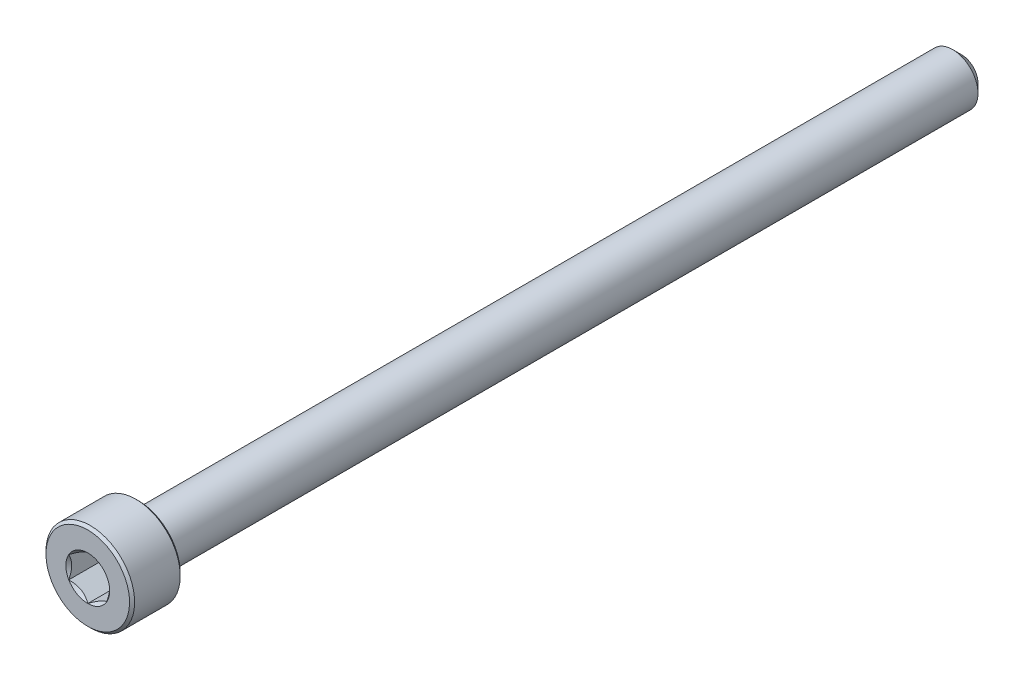
ISO-10303-21;
HEADER;
FILE_DESCRIPTION(('STEP AP214'),'2;1');
FILE_NAME('part.step','',(''),(''),'','','');
FILE_SCHEMA(('AUTOMOTIVE_DESIGN { 1 0 10303 214 1 1 1 1 }'));
ENDSEC;
DATA;
#1=APPLICATION_CONTEXT('core data for automotive mechanical design processes');
#2=APPLICATION_PROTOCOL_DEFINITION('international standard','automotive_design',2000,#1);
#3=PRODUCT_CONTEXT('',#1,'mechanical');
#4=PRODUCT('Part','Part','',(#3));
#5=PRODUCT_RELATED_PRODUCT_CATEGORY('part','',(#4));
#6=PRODUCT_DEFINITION_FORMATION('','',#4);
#7=PRODUCT_DEFINITION_CONTEXT('part definition',#1,'design');
#8=PRODUCT_DEFINITION('design','',#6,#7);
#9=PRODUCT_DEFINITION_SHAPE('','',#8);
#10=(LENGTH_UNIT() NAMED_UNIT(*) SI_UNIT(.MILLI.,.METRE.));
#11=(NAMED_UNIT(*) PLANE_ANGLE_UNIT() SI_UNIT($,.RADIAN.));
#12=(NAMED_UNIT(*) SI_UNIT($,.STERADIAN.) SOLID_ANGLE_UNIT());
#13=UNCERTAINTY_MEASURE_WITH_UNIT(LENGTH_MEASURE(1.E-05),#10,'distance_accuracy_value','');
#14=(GEOMETRIC_REPRESENTATION_CONTEXT(3) GLOBAL_UNCERTAINTY_ASSIGNED_CONTEXT((#13)) GLOBAL_UNIT_ASSIGNED_CONTEXT((#10,
#11,#12)) REPRESENTATION_CONTEXT('',''));
#15=CARTESIAN_POINT('',(0.,0.,0.));
#16=DIRECTION('',(0.,0.,1.));
#17=DIRECTION('',(1.,0.,0.));
#18=AXIS2_PLACEMENT_3D('',#15,#16,#17);
#19=CARTESIAN_POINT('',(0.,0.,34.5));
#20=DIRECTION('',(0.,0.,1.));
#21=DIRECTION('',(0.,-1.,0.));
#22=AXIS2_PLACEMENT_3D('',#19,#20,#21);
#23=PLANE('',#22);
#24=CARTESIAN_POINT('',(0.,0.,34.5));
#25=DIRECTION('',(0.,0.,1.));
#26=DIRECTION('',(1.,0.,0.));
#27=AXIS2_PLACEMENT_3D('',#24,#25,#26);
#28=CIRCLE('',#27,1.73205080756888);
#29=CARTESIAN_POINT('',(0.,-1.73205080756888,34.5));
#30=VERTEX_POINT('',#29);
#31=CARTESIAN_POINT('',(1.5,-0.866025403784438,34.5));
#32=VERTEX_POINT('',#31);
#33=EDGE_CURVE('E99',#30,#32,#28,.T.);
#34=ORIENTED_EDGE('',*,*,#33,.F.);
#35=CARTESIAN_POINT('',(-1.5,-0.866025403784438,34.5));
#36=VERTEX_POINT('',#35);
#37=EDGE_CURVE('E269',#36,#30,#28,.T.);
#38=ORIENTED_EDGE('',*,*,#37,.F.);
#39=CARTESIAN_POINT('',(-1.5,0.866025403784439,34.5));
#40=VERTEX_POINT('',#39);
#41=EDGE_CURVE('E134',#40,#36,#28,.T.);
#42=ORIENTED_EDGE('',*,*,#41,.F.);
#43=CARTESIAN_POINT('',(0.,1.73205080756888,34.5));
#44=VERTEX_POINT('',#43);
#45=EDGE_CURVE('E130',#44,#40,#28,.T.);
#46=ORIENTED_EDGE('',*,*,#45,.F.);
#47=CARTESIAN_POINT('',(1.5,0.866025403784439,34.5));
#48=VERTEX_POINT('',#47);
#49=EDGE_CURVE('E101',#48,#44,#28,.T.);
#50=ORIENTED_EDGE('',*,*,#49,.F.);
#51=EDGE_CURVE('E93',#32,#48,#28,.T.);
#52=ORIENTED_EDGE('',*,*,#51,.F.);
#53=EDGE_LOOP('',(#34,#38,#42,#46,#50,#52));
#54=FACE_BOUND('',#53,.T.);
#55=CARTESIAN_POINT('',(0.,0.,34.5));
#56=DIRECTION('',(0.,0.,-1.));
#57=DIRECTION('',(0.,1.,0.));
#58=AXIS2_PLACEMENT_3D('',#55,#56,#57);
#59=CIRCLE('',#58,3.3);
#60=CARTESIAN_POINT('',(0.,3.3,34.5));
#61=VERTEX_POINT('',#60);
#62=EDGE_CURVE('E49',#61,#61,#59,.T.);
#63=ORIENTED_EDGE('',*,*,#62,.F.);
#64=EDGE_LOOP('',(#63));
#65=FACE_BOUND('',#64,.T.);
#66=ADVANCED_FACE('F36',(#54,#65),#23,.T.);
#67=CARTESIAN_POINT('',(0.,0.,34.3));
#68=DIRECTION('',(0.,0.,-1.));
#69=DIRECTION('',(0.,1.,0.));
#70=AXIS2_PLACEMENT_3D('',#67,#68,#69);
#71=CONICAL_SURFACE('',#70,3.5,0.785398163397435);
#72=ORIENTED_EDGE('',*,*,#62,.T.);
#73=EDGE_LOOP('',(#72));
#74=FACE_BOUND('',#73,.T.);
#75=CARTESIAN_POINT('',(0.,0.,34.3));
#76=DIRECTION('',(0.,0.,-1.));
#77=DIRECTION('',(0.,1.,0.));
#78=AXIS2_PLACEMENT_3D('',#75,#76,#77);
#79=CIRCLE('',#78,3.5);
#80=CARTESIAN_POINT('',(0.,3.5,34.3));
#81=VERTEX_POINT('',#80);
#82=EDGE_CURVE('E220',#81,#81,#79,.T.);
#83=ORIENTED_EDGE('',*,*,#82,.F.);
#84=EDGE_LOOP('',(#83));
#85=FACE_BOUND('',#84,.T.);
#86=ADVANCED_FACE('F208',(#74,#85),#71,.T.);
#87=CARTESIAN_POINT('',(0.,0.,-34.5));
#88=DIRECTION('',(0.,0.,-1.));
#89=DIRECTION('',(0.,1.,0.));
#90=AXIS2_PLACEMENT_3D('',#87,#88,#89);
#91=CYLINDRICAL_SURFACE('',#90,3.5);
#92=ORIENTED_EDGE('',*,*,#82,.T.);
#93=EDGE_LOOP('',(#92));
#94=FACE_BOUND('',#93,.T.);
#95=CARTESIAN_POINT('',(0.,0.,30.7));
#96=DIRECTION('',(0.,0.,-1.));
#97=DIRECTION('',(0.,1.,0.));
#98=AXIS2_PLACEMENT_3D('',#95,#96,#97);
#99=CIRCLE('',#98,3.5);
#100=CARTESIAN_POINT('',(0.,3.5,30.7));
#101=VERTEX_POINT('',#100);
#102=EDGE_CURVE('E221',#101,#101,#99,.T.);
#103=ORIENTED_EDGE('',*,*,#102,.F.);
#104=EDGE_LOOP('',(#103));
#105=FACE_BOUND('',#104,.T.);
#106=ADVANCED_FACE('F205',(#94,#105),#91,.T.);
#107=CARTESIAN_POINT('',(0.,0.,30.5));
#108=DIRECTION('',(0.,0.,1.));
#109=DIRECTION('',(0.,-1.,0.));
#110=AXIS2_PLACEMENT_3D('',#107,#108,#109);
#111=CONICAL_SURFACE('',#110,3.3,0.785398163397434);
#112=ORIENTED_EDGE('',*,*,#102,.T.);
#113=EDGE_LOOP('',(#112));
#114=FACE_BOUND('',#113,.T.);
#115=CARTESIAN_POINT('',(0.,0.,30.5));
#116=DIRECTION('',(0.,0.,-1.));
#117=DIRECTION('',(0.,1.,0.));
#118=AXIS2_PLACEMENT_3D('',#115,#116,#117);
#119=CIRCLE('',#118,3.3);
#120=CARTESIAN_POINT('',(0.,3.3,30.5));
#121=VERTEX_POINT('',#120);
#122=EDGE_CURVE('E224',#121,#121,#119,.T.);
#123=ORIENTED_EDGE('',*,*,#122,.F.);
#124=EDGE_LOOP('',(#123));
#125=FACE_BOUND('',#124,.T.);
#126=ADVANCED_FACE('F201',(#114,#125),#111,.T.);
#127=CARTESIAN_POINT('',(0.,3.3,30.5));
#128=DIRECTION('',(0.,0.,-1.));
#129=DIRECTION('',(0.,1.,0.));
#130=AXIS2_PLACEMENT_3D('',#127,#128,#129);
#131=PLANE('',#130);
#132=ORIENTED_EDGE('',*,*,#122,.T.);
#133=EDGE_LOOP('',(#132));
#134=FACE_BOUND('',#133,.T.);
#135=CARTESIAN_POINT('',(0.,0.,30.5));
#136=DIRECTION('',(0.,0.,-1.));
#137=DIRECTION('',(0.,1.,0.));
#138=AXIS2_PLACEMENT_3D('',#135,#136,#137);
#139=CIRCLE('',#138,1.99999999999999);
#140=CARTESIAN_POINT('',(0.,1.99999999999999,30.5));
#141=VERTEX_POINT('',#140);
#142=EDGE_CURVE('E229',#141,#141,#139,.T.);
#143=ORIENTED_EDGE('',*,*,#142,.F.);
#144=EDGE_LOOP('',(#143));
#145=FACE_BOUND('',#144,.T.);
#146=ADVANCED_FACE('F197',(#134,#145),#131,.T.);
#147=CARTESIAN_POINT('',(0.,0.,-34.5));
#148=DIRECTION('',(0.,0.,-1.));
#149=DIRECTION('',(0.,1.,0.));
#150=AXIS2_PLACEMENT_3D('',#147,#148,#149);
#151=CYLINDRICAL_SURFACE('',#150,1.99999999999999);
#152=ORIENTED_EDGE('',*,*,#142,.T.);
#153=EDGE_LOOP('',(#152));
#154=FACE_BOUND('',#153,.T.);
#155=CARTESIAN_POINT('',(0.,0.,-33.8));
#156=DIRECTION('',(0.,0.,-1.));
#157=DIRECTION('',(0.,1.,0.));
#158=AXIS2_PLACEMENT_3D('',#155,#156,#157);
#159=CIRCLE('',#158,2.);
#160=CARTESIAN_POINT('',(0.,2.,-33.8));
#161=VERTEX_POINT('',#160);
#162=EDGE_CURVE('E232',#161,#161,#159,.T.);
#163=ORIENTED_EDGE('',*,*,#162,.F.);
#164=EDGE_LOOP('',(#163));
#165=FACE_BOUND('',#164,.T.);
#166=ADVANCED_FACE('F193',(#154,#165),#151,.T.);
#167=CARTESIAN_POINT('',(0.,0.,-34.5));
#168=DIRECTION('',(0.,0.,1.));
#169=DIRECTION('',(0.,-1.,0.));
#170=AXIS2_PLACEMENT_3D('',#167,#168,#169);
#171=CONICAL_SURFACE('',#170,1.3,0.785398163397449);
#172=ORIENTED_EDGE('',*,*,#162,.T.);
#173=EDGE_LOOP('',(#172));
#174=FACE_BOUND('',#173,.T.);
#175=CARTESIAN_POINT('',(0.,0.,-34.5));
#176=DIRECTION('',(0.,0.,-1.));
#177=DIRECTION('',(0.,1.,0.));
#178=AXIS2_PLACEMENT_3D('',#175,#176,#177);
#179=CIRCLE('',#178,1.3);
#180=CARTESIAN_POINT('',(0.,1.3,-34.5));
#181=VERTEX_POINT('',#180);
#182=EDGE_CURVE('E235',#181,#181,#179,.T.);
#183=ORIENTED_EDGE('',*,*,#182,.F.);
#184=EDGE_LOOP('',(#183));
#185=FACE_BOUND('',#184,.T.);
#186=ADVANCED_FACE('F189',(#174,#185),#171,.T.);
#187=CARTESIAN_POINT('',(0.,1.3,-34.5));
#188=DIRECTION('',(0.,0.,-1.));
#189=DIRECTION('',(0.,1.,0.));
#190=AXIS2_PLACEMENT_3D('',#187,#188,#189);
#191=PLANE('',#190);
#192=ORIENTED_EDGE('',*,*,#182,.T.);
#193=EDGE_LOOP('',(#192));
#194=FACE_BOUND('',#193,.T.);
#195=ADVANCED_FACE('F186',(#194),#191,.T.);
#196=CARTESIAN_POINT('',(0.,0.,34.5));
#197=DIRECTION('',(0.,0.,1.));
#198=DIRECTION('',(1.,0.,0.));
#199=AXIS2_PLACEMENT_3D('',#196,#197,#198);
#200=CONICAL_SURFACE('',#199,1.73205080756888,0.78539816339745);
#201=ORIENTED_EDGE('',*,*,#33,.T.);
#202=CARTESIAN_POINT('',(-0.000199999999999772,-1.73216627762271,34.5001154816001));
#203=CARTESIAN_POINT('',(0.0513677907370751,-1.70239359975915,34.4703654760673));
#204=CARTESIAN_POINT('',(0.103797917665199,-1.67212305186355,34.4423624839103));
#205=CARTESIAN_POINT('',(0.210709034055595,-1.61039789003619,34.3910892304401));
#206=CARTESIAN_POINT('',(0.26520019581466,-1.57893740312614,34.3678475050444));
#207=CARTESIAN_POINT('',(0.375079081357247,-1.51549879897987,34.3280337289922));
#208=CARTESIAN_POINT('',(0.430438809095198,-1.4835368452681,34.3113615856709));
#209=CARTESIAN_POINT('',(0.542377257477148,-1.41890915196211,34.2856744568181));
#210=CARTESIAN_POINT('',(0.598952556553006,-1.38624538781118,34.2766402904789));
#211=CARTESIAN_POINT('',(0.696455389516438,-1.329952100953,34.2684890812269));
#212=CARTESIAN_POINT('',(0.737256908280463,-1.30639533311124,34.2672822529892));
#213=CARTESIAN_POINT('',(0.818787969615855,-1.25932335290193,34.2693140571623));
#214=CARTESIAN_POINT('',(0.859517494314627,-1.23580815085313,34.2725536707483));
#215=CARTESIAN_POINT('',(0.940584402163413,-1.18900414978427,34.283291985982));
#216=CARTESIAN_POINT('',(0.980921384598285,-1.1657155821172,34.2907946530187));
#217=CARTESIAN_POINT('',(1.06091833691403,-1.11952932016335,34.3096516119283));
#218=CARTESIAN_POINT('',(1.1005780085162,-1.09663179808786,34.3210075570186));
#219=CARTESIAN_POINT('',(1.20216313477448,-1.03798159809699,34.3547216475927));
#220=CARTESIAN_POINT('',(1.26345855370968,-1.00259267147465,34.3796218490934));
#221=CARTESIAN_POINT('',(1.35358562846331,-0.950557780604376,34.4216566532716));
#222=CARTESIAN_POINT('',(1.38328513990771,-0.933410759677149,34.4364251535591));
#223=CARTESIAN_POINT('',(1.44213790138375,-0.899432101996408,34.4673105659402));
#224=CARTESIAN_POINT('',(1.47129140422064,-0.88260031928571,34.4834268341217));
#225=CARTESIAN_POINT('',(1.5002,-0.865909933730599,34.5001154816001));
#226=B_SPLINE_CURVE_WITH_KNOTS('',3,(#202,#203,#204,#205,#206,#207,#208,#209,#210,#211,#212,
#213,#214,#215,#216,#217,#218,#219,#220,#221,#222,#223,#224,#225),.UNSPECIFIED.,.F.,.F.,(4,2,2,
2,2,2,2,2,2,2,2,4),(0.,0.199829143693301,0.400822987382388,0.598623720538179,0.795926240188886,
0.937113067959878,1.07833105577192,1.21968061668222,1.36109089931054,1.58570969637565,
1.69770705470963,1.80965120737194),.UNSPECIFIED.);
#227=EDGE_CURVE('E12',#30,#32,#226,.T.);
#228=ORIENTED_EDGE('',*,*,#227,.F.);
#229=EDGE_LOOP('',(#201,#228));
#230=FACE_BOUND('',#229,.T.);
#231=ADVANCED_FACE('F152',(#230),#200,.F.);
#232=ORIENTED_EDGE('',*,*,#37,.T.);
#233=CARTESIAN_POINT('',(-1.5002,-0.8659099337306,34.5001154816001));
#234=CARTESIAN_POINT('',(-1.44863220926292,-0.895682611594165,34.4703654760673));
#235=CARTESIAN_POINT('',(-1.3962020823348,-0.925953159489764,34.4423624839103));
#236=CARTESIAN_POINT('',(-1.2892909659444,-0.987678321317123,34.3910892304401));
#237=CARTESIAN_POINT('',(-1.23479980418534,-1.01913880822717,34.3678475050444));
#238=CARTESIAN_POINT('',(-1.12492091864275,-1.08257741237344,34.3280337289922));
#239=CARTESIAN_POINT('',(-1.0695611909048,-1.11453936608521,34.3113615856709));
#240=CARTESIAN_POINT('',(-0.957622742522849,-1.1791670593912,34.2856744568181));
#241=CARTESIAN_POINT('',(-0.901047443446992,-1.21183082354213,34.2766402904789));
#242=CARTESIAN_POINT('',(-0.803544610483562,-1.26812411040032,34.2684890812269));
#243=CARTESIAN_POINT('',(-0.762743091719536,-1.29168087824207,34.2672822529892));
#244=CARTESIAN_POINT('',(-0.681212030384145,-1.33875285845138,34.2693140571623));
#245=CARTESIAN_POINT('',(-0.640482505685373,-1.36226806050018,34.2725536707483));
#246=CARTESIAN_POINT('',(-0.559415597836587,-1.40907206156905,34.283291985982));
#247=CARTESIAN_POINT('',(-0.519078615401714,-1.43236062923612,34.2907946530187));
#248=CARTESIAN_POINT('',(-0.439081663085971,-1.47854689118996,34.3096516119283));
#249=CARTESIAN_POINT('',(-0.399421991483795,-1.50144441326545,34.3210075570186));
#250=CARTESIAN_POINT('',(-0.297836865225519,-1.56009461325633,34.3547216475927));
#251=CARTESIAN_POINT('',(-0.236541446290314,-1.59548353987866,34.3796218490934));
#252=CARTESIAN_POINT('',(-0.146414371536689,-1.64751843074894,34.4216566532716));
#253=CARTESIAN_POINT('',(-0.116714860092283,-1.66466545167617,34.4364251535591));
#254=CARTESIAN_POINT('',(-0.0578620986162486,-1.69864410935691,34.4673105659402));
#255=CARTESIAN_POINT('',(-0.0287085957793621,-1.7154758920676,34.4834268341217));
#256=CARTESIAN_POINT('',(0.000200000000000444,-1.73216627762271,34.5001154816001));
#257=B_SPLINE_CURVE_WITH_KNOTS('',3,(#233,#234,#235,#236,#237,#238,#239,#240,#241,#242,#243,
#244,#245,#246,#247,#248,#249,#250,#251,#252,#253,#254,#255,#256),.UNSPECIFIED.,.F.,.F.,(4,2,2,
2,2,2,2,2,2,2,2,4),(0.,0.199829143693308,0.400822987382388,0.598623720538182,0.795926240188887,
0.937113067959878,1.07833105577192,1.21968061668221,1.36109089931054,1.58570969637565,
1.69770705470963,1.80965120737194),.UNSPECIFIED.);
#258=EDGE_CURVE('E131',#36,#30,#257,.T.);
#259=ORIENTED_EDGE('',*,*,#258,.F.);
#260=EDGE_LOOP('',(#232,#259));
#261=FACE_BOUND('',#260,.T.);
#262=ADVANCED_FACE('F267',(#261),#200,.F.);
#263=ORIENTED_EDGE('',*,*,#41,.T.);
#264=CARTESIAN_POINT('',(-1.5,-1.72720812969692,35.0555785162708));
#265=CARTESIAN_POINT('',(-1.5,-1.68515175699268,35.0238299078574));
#266=CARTESIAN_POINT('',(-1.5,-1.64286104748673,34.9923925938074));
#267=CARTESIAN_POINT('',(-1.5,-1.55771581035942,34.9302690875564));
#268=CARTESIAN_POINT('',(-1.5,-1.51486114386668,34.8995830858922));
#269=CARTESIAN_POINT('',(-1.5,-1.3846813415127,34.8084071924272));
#270=CARTESIAN_POINT('',(-1.5,-1.29637976071654,34.7492883434268));
#271=CARTESIAN_POINT('',(-1.5,-1.11121478730467,34.6332309963165));
#272=CARTESIAN_POINT('',(-1.5,-1.01415038238167,34.576609558733));
#273=CARTESIAN_POINT('',(-1.5,-0.815173408897607,34.4730368812657));
#274=CARTESIAN_POINT('',(-1.5,-0.713278669253288,34.4260530415417));
#275=CARTESIAN_POINT('',(-1.5,-0.560333774943114,34.3685726684308));
#276=CARTESIAN_POINT('',(-1.5,-0.511547982948044,34.3520753877573));
#277=CARTESIAN_POINT('',(-1.5,-0.412798620136868,34.322997512927));
#278=CARTESIAN_POINT('',(-1.5,-0.362834968437563,34.310417188594));
#279=CARTESIAN_POINT('',(-1.5,-0.262863235444982,34.2900361941468));
#280=CARTESIAN_POINT('',(-1.5,-0.212872113808023,34.282153632746));
#281=CARTESIAN_POINT('',(-1.5,-0.112355243569545,34.271322063969));
#282=CARTESIAN_POINT('',(-1.5,-0.0618295883726281,34.2683722085243));
#283=CARTESIAN_POINT('',(-1.5,0.0374291733323835,34.2676248577249));
#284=CARTESIAN_POINT('',(-1.5,0.086160967200298,34.2696447335581));
#285=CARTESIAN_POINT('',(-1.5,0.183206937768826,34.2783225528968));
#286=CARTESIAN_POINT('',(-1.5,0.231521073438268,34.2849809469685));
#287=CARTESIAN_POINT('',(-1.5,0.328199853425435,34.3026852441226));
#288=CARTESIAN_POINT('',(-1.5,0.376550616310327,34.313805811257));
#289=CARTESIAN_POINT('',(-1.5,0.472195697125597,34.3398434140487));
#290=CARTESIAN_POINT('',(-1.5,0.519490103092739,34.3547601320409));
#291=CARTESIAN_POINT('',(-1.5,0.668391282696625,34.4073352235961));
#292=CARTESIAN_POINT('',(-1.5,0.767878709508554,34.450981287472));
#293=CARTESIAN_POINT('',(-1.5,0.962179866690723,34.5480229945931));
#294=CARTESIAN_POINT('',(-1.5,1.05697519961444,34.6014536650895));
#295=CARTESIAN_POINT('',(-1.5,1.23814273533382,34.7116858520046));
#296=CARTESIAN_POINT('',(-1.5,1.32469942181289,34.7681879206986));
#297=CARTESIAN_POINT('',(-1.5,1.45222331290673,34.8555343015787));
#298=CARTESIAN_POINT('',(-1.5,1.49418091978755,34.88495775868));
#299=CARTESIAN_POINT('',(-1.5,1.57752272931476,34.9445828218305));
#300=CARTESIAN_POINT('',(-1.5,1.61890708647353,34.9747842116644));
#301=CARTESIAN_POINT('',(-1.5,1.66005278019493,35.0053081786095));
#302=B_SPLINE_CURVE_WITH_KNOTS('',3,(#264,#265,#266,#267,#268,#269,#270,#271,#272,#273,#274,
#275,#276,#277,#278,#279,#280,#281,#282,#283,#284,#285,#286,#287,#288,#289,#290,#291,#292,#293,
#294,#295,#296,#297,#298,#299,#300,#301),.UNSPECIFIED.,.F.,.F.,(4,2,2,2,2,2,2,2,2,2,2,2,2,2,2,2,
2,2,4),(0.,0.158079548982671,0.316198780993938,0.634850417346953,0.971690311361504,
1.30737131660667,1.46173961127088,1.61611853740677,1.76772101421409,1.91929742368538,
2.065387412096,2.21149159305544,2.36014984633872,2.50879566386709,2.83376031422673,
3.15991186985651,3.46985601802197,3.62358896039973,3.77727962642069),.UNSPECIFIED.);
#303=EDGE_CURVE('E132',#40,#36,#302,.F.);
#304=ORIENTED_EDGE('',*,*,#303,.F.);
#305=EDGE_LOOP('',(#263,#304));
#306=FACE_BOUND('',#305,.T.);
#307=ADVANCED_FACE('F272',(#306),#200,.F.);
#308=ORIENTED_EDGE('',*,*,#45,.T.);
#309=CARTESIAN_POINT('',(0.000200000000000089,1.73216627762271,34.5001154816001));
#310=CARTESIAN_POINT('',(-0.0513677907370767,1.70239359975915,34.4703654760673));
#311=CARTESIAN_POINT('',(-0.103797917665202,1.67212305186355,34.4423624839103));
#312=CARTESIAN_POINT('',(-0.210709034055597,1.61039789003619,34.3910892304401));
#313=CARTESIAN_POINT('',(-0.26520019581466,1.57893740312614,34.3678475050444));
#314=CARTESIAN_POINT('',(-0.375079081357247,1.51549879897987,34.3280337289922));
#315=CARTESIAN_POINT('',(-0.430438809095198,1.4835368452681,34.3113615856709));
#316=CARTESIAN_POINT('',(-0.542377257477148,1.41890915196211,34.2856744568181));
#317=CARTESIAN_POINT('',(-0.598952556553006,1.38624538781118,34.2766402904789));
#318=CARTESIAN_POINT('',(-0.696455389516438,1.329952100953,34.2684890812269));
#319=CARTESIAN_POINT('',(-0.737256908280463,1.30639533311124,34.2672822529892));
#320=CARTESIAN_POINT('',(-0.818787969615854,1.25932335290194,34.2693140571623));
#321=CARTESIAN_POINT('',(-0.859517494314626,1.23580815085313,34.2725536707483));
#322=CARTESIAN_POINT('',(-0.940584402163412,1.18900414978427,34.283291985982));
#323=CARTESIAN_POINT('',(-0.980921384598284,1.1657155821172,34.2907946530187));
#324=CARTESIAN_POINT('',(-1.06091833691403,1.11952932016335,34.3096516119283));
#325=CARTESIAN_POINT('',(-1.1005780085162,1.09663179808786,34.3210075570186));
#326=CARTESIAN_POINT('',(-1.20216313477448,1.03798159809698,34.3547216475927));
#327=CARTESIAN_POINT('',(-1.26345855370969,1.00259267147465,34.3796218490934));
#328=CARTESIAN_POINT('',(-1.35358562846331,0.950557780604373,34.4216566532716));
#329=CARTESIAN_POINT('',(-1.38328513990772,0.933410759677146,34.4364251535591));
#330=CARTESIAN_POINT('',(-1.44213790138375,0.899432101996405,34.4673105659402));
#331=CARTESIAN_POINT('',(-1.47129140422064,0.882600319285709,34.4834268341217));
#332=CARTESIAN_POINT('',(-1.5002,0.8659099337306,34.5001154816001));
#333=B_SPLINE_CURVE_WITH_KNOTS('',3,(#309,#310,#311,#312,#313,#314,#315,#316,#317,#318,#319,
#320,#321,#322,#323,#324,#325,#326,#327,#328,#329,#330,#331,#332),.UNSPECIFIED.,.F.,.F.,(4,2,2,
2,2,2,2,2,2,2,2,4),(0.,0.199829143693305,0.400822987382387,0.598623720538179,0.795926240188887,
0.937113067959878,1.07833105577192,1.21968061668222,1.36109089931054,1.58570969637565,
1.69770705470964,1.80965120737194),.UNSPECIFIED.);
#334=EDGE_CURVE('E111',#44,#40,#333,.T.);
#335=ORIENTED_EDGE('',*,*,#334,.F.);
#336=EDGE_LOOP('',(#308,#335));
#337=FACE_BOUND('',#336,.T.);
#338=ADVANCED_FACE('F306',(#337),#200,.F.);
#339=ORIENTED_EDGE('',*,*,#49,.T.);
#340=CARTESIAN_POINT('',(1.5002,0.8659099337306,34.5001154816001));
#341=CARTESIAN_POINT('',(1.44863220926292,0.895682611594165,34.4703654760673));
#342=CARTESIAN_POINT('',(1.3962020823348,0.925953159489764,34.4423624839103));
#343=CARTESIAN_POINT('',(1.2892909659444,0.987678321317122,34.3910892304401));
#344=CARTESIAN_POINT('',(1.23479980418534,1.01913880822717,34.3678475050444));
#345=CARTESIAN_POINT('',(1.12492091864275,1.08257741237344,34.3280337289922));
#346=CARTESIAN_POINT('',(1.0695611909048,1.11453936608521,34.3113615856709));
#347=CARTESIAN_POINT('',(0.957622742522852,1.1791670593912,34.2856744568181));
#348=CARTESIAN_POINT('',(0.901047443446994,1.21183082354213,34.2766402904789));
#349=CARTESIAN_POINT('',(0.803544610483562,1.26812411040032,34.2684890812269));
#350=CARTESIAN_POINT('',(0.762743091719537,1.29168087824207,34.2672822529892));
#351=CARTESIAN_POINT('',(0.681212030384144,1.33875285845138,34.2693140571623));
#352=CARTESIAN_POINT('',(0.640482505685373,1.36226806050018,34.2725536707483));
#353=CARTESIAN_POINT('',(0.559415597836587,1.40907206156905,34.283291985982));
#354=CARTESIAN_POINT('',(0.519078615401715,1.43236062923612,34.2907946530187));
#355=CARTESIAN_POINT('',(0.439081663085972,1.47854689118996,34.3096516119283));
#356=CARTESIAN_POINT('',(0.399421991483796,1.50144441326545,34.3210075570186));
#357=CARTESIAN_POINT('',(0.297836865225519,1.56009461325633,34.3547216475927));
#358=CARTESIAN_POINT('',(0.236541446290314,1.59548353987866,34.3796218490934));
#359=CARTESIAN_POINT('',(0.14641437153669,1.64751843074894,34.4216566532716));
#360=CARTESIAN_POINT('',(0.116714860092286,1.66466545167616,34.4364251535591));
#361=CARTESIAN_POINT('',(0.057862098616252,1.69864410935691,34.4673105659402));
#362=CARTESIAN_POINT('',(0.0287085957793641,1.7154758920676,34.4834268341217));
#363=CARTESIAN_POINT('',(-0.000200000000000555,1.73216627762271,34.5001154816001));
#364=B_SPLINE_CURVE_WITH_KNOTS('',3,(#340,#341,#342,#343,#344,#345,#346,#347,#348,#349,#350,
#351,#352,#353,#354,#355,#356,#357,#358,#359,#360,#361,#362,#363),.UNSPECIFIED.,.F.,.F.,(4,2,2,
2,2,2,2,2,2,2,2,4),(0.,0.199829143693303,0.400822987382388,0.598623720538179,0.795926240188886,
0.937113067959878,1.07833105577192,1.21968061668222,1.36109089931054,1.58570969637565,
1.69770705470963,1.80965120737194),.UNSPECIFIED.);
#365=EDGE_CURVE('E104',#48,#44,#364,.T.);
#366=ORIENTED_EDGE('',*,*,#365,.F.);
#367=EDGE_LOOP('',(#339,#366));
#368=FACE_BOUND('',#367,.T.);
#369=ADVANCED_FACE('F105',(#368),#200,.F.);
#370=ORIENTED_EDGE('',*,*,#51,.T.);
#371=CARTESIAN_POINT('',(1.5,-1.72720812969692,35.0555785162708));
#372=CARTESIAN_POINT('',(1.5,-1.68515175699267,35.0238299078574));
#373=CARTESIAN_POINT('',(1.5,-1.64286104748673,34.9923925938074));
#374=CARTESIAN_POINT('',(1.5,-1.55771581035941,34.9302690875564));
#375=CARTESIAN_POINT('',(1.5,-1.51486114386667,34.8995830858922));
#376=CARTESIAN_POINT('',(1.5,-1.38468134151269,34.8084071924272));
#377=CARTESIAN_POINT('',(1.5,-1.29637976071653,34.7492883434268));
#378=CARTESIAN_POINT('',(1.5,-1.11121478730466,34.6332309963165));
#379=CARTESIAN_POINT('',(1.5,-1.01415038238166,34.576609558733));
#380=CARTESIAN_POINT('',(1.5,-0.815173408897596,34.4730368812656));
#381=CARTESIAN_POINT('',(1.5,-0.713278669253279,34.4260530415417));
#382=CARTESIAN_POINT('',(1.5,-0.560333774943106,34.3685726684308));
#383=CARTESIAN_POINT('',(1.5,-0.511547982948036,34.3520753877573));
#384=CARTESIAN_POINT('',(1.5,-0.41279862013686,34.322997512927));
#385=CARTESIAN_POINT('',(1.5,-0.362834968437556,34.310417188594));
#386=CARTESIAN_POINT('',(1.5,-0.262863235444976,34.2900361941468));
#387=CARTESIAN_POINT('',(1.5,-0.212872113808017,34.282153632746));
#388=CARTESIAN_POINT('',(1.5,-0.112355243569541,34.271322063969));
#389=CARTESIAN_POINT('',(1.5,-0.0618295883726233,34.2683722085244));
#390=CARTESIAN_POINT('',(1.5,0.0374291733323881,34.2676248577249));
#391=CARTESIAN_POINT('',(1.5,0.0861609672003026,34.2696447335581));
#392=CARTESIAN_POINT('',(1.5,0.18320693776883,34.2783225528968));
#393=CARTESIAN_POINT('',(1.5,0.231521073438272,34.2849809469685));
#394=CARTESIAN_POINT('',(1.5,0.328199853425439,34.3026852441226));
#395=CARTESIAN_POINT('',(1.5,0.376550616310331,34.313805811257));
#396=CARTESIAN_POINT('',(1.5,0.472195697125601,34.3398434140487));
#397=CARTESIAN_POINT('',(1.5,0.519490103092742,34.3547601320409));
#398=CARTESIAN_POINT('',(1.5,0.668391282696626,34.4073352235961));
#399=CARTESIAN_POINT('',(1.5,0.767878709508553,34.450981287472));
#400=CARTESIAN_POINT('',(1.5,0.962179866690724,34.5480229945931));
#401=CARTESIAN_POINT('',(1.5,1.05697519961444,34.6014536650895));
#402=CARTESIAN_POINT('',(1.5,1.23814273533383,34.7116858520046));
#403=CARTESIAN_POINT('',(1.5,1.3246994218129,34.7681879206986));
#404=CARTESIAN_POINT('',(1.5,1.45222331290674,34.8555343015787));
#405=CARTESIAN_POINT('',(1.5,1.49418091978756,34.8849577586801));
#406=CARTESIAN_POINT('',(1.5,1.57752272931477,34.9445828218305));
#407=CARTESIAN_POINT('',(1.5,1.61890708647355,34.9747842116644));
#408=CARTESIAN_POINT('',(1.5,1.66005278019494,35.0053081786095));
#409=B_SPLINE_CURVE_WITH_KNOTS('',3,(#371,#372,#373,#374,#375,#376,#377,#378,#379,#380,#381,
#382,#383,#384,#385,#386,#387,#388,#389,#390,#391,#392,#393,#394,#395,#396,#397,#398,#399,#400,
#401,#402,#403,#404,#405,#406,#407,#408),.UNSPECIFIED.,.F.,.F.,(4,2,2,2,2,2,2,2,2,2,2,2,2,2,2,2,
2,2,4),(0.,0.158079548982668,0.316198780993944,0.634850417346959,0.971690311361511,
1.30737131660667,1.46173961127088,1.61611853740677,1.76772101421409,1.91929742368537,
2.06538741209599,2.21149159305543,2.36014984633871,2.50879566386708,2.83376031422672,
3.15991186985651,3.46985601802197,3.62358896039973,3.7772796264207),.UNSPECIFIED.);
#410=EDGE_CURVE('E55',#32,#48,#409,.T.);
#411=ORIENTED_EDGE('',*,*,#410,.F.);
#412=EDGE_LOOP('',(#370,#411));
#413=FACE_BOUND('',#412,.T.);
#414=ADVANCED_FACE('F95',(#413),#200,.F.);
#415=CARTESIAN_POINT('',(0.,3.3,31.5));
#416=DIRECTION('',(0.,0.,-1.));
#417=DIRECTION('',(0.,1.,0.));
#418=AXIS2_PLACEMENT_3D('',#415,#416,#417);
#419=PLANE('',#418);
#420=DIRECTION('',(0.866025403784439,0.5,0.));
#421=VECTOR('',#420,1.);
#422=CARTESIAN_POINT('',(0.,-1.73205080756888,31.5));
#423=LINE('',#422,#421);
#424=CARTESIAN_POINT('',(0.,-1.73205080756888,31.5));
#425=VERTEX_POINT('',#424);
#426=CARTESIAN_POINT('',(1.5,-0.866025403784437,31.5));
#427=VERTEX_POINT('',#426);
#428=EDGE_CURVE('E238',#425,#427,#423,.T.);
#429=ORIENTED_EDGE('',*,*,#428,.T.);
#430=DIRECTION('',(0.,1.,0.));
#431=VECTOR('',#430,1.);
#432=CARTESIAN_POINT('',(1.5,-0.866025403784437,31.5));
#433=LINE('',#432,#431);
#434=CARTESIAN_POINT('',(1.5,0.866025403784438,31.5));
#435=VERTEX_POINT('',#434);
#436=EDGE_CURVE('E121',#427,#435,#433,.T.);
#437=ORIENTED_EDGE('',*,*,#436,.T.);
#438=DIRECTION('',(-0.866025403784439,0.5,0.));
#439=VECTOR('',#438,1.);
#440=CARTESIAN_POINT('',(1.5,0.866025403784438,31.5));
#441=LINE('',#440,#439);
#442=CARTESIAN_POINT('',(0.,1.73205080756888,31.5));
#443=VERTEX_POINT('',#442);
#444=EDGE_CURVE('E125',#435,#443,#441,.T.);
#445=ORIENTED_EDGE('',*,*,#444,.T.);
#446=DIRECTION('',(-0.866025403784439,-0.5,0.));
#447=VECTOR('',#446,1.);
#448=CARTESIAN_POINT('',(0.,1.73205080756888,31.5));
#449=LINE('',#448,#447);
#450=CARTESIAN_POINT('',(-1.5,0.866025403784438,31.5));
#451=VERTEX_POINT('',#450);
#452=EDGE_CURVE('E242',#443,#451,#449,.T.);
#453=ORIENTED_EDGE('',*,*,#452,.T.);
#454=DIRECTION('',(0.,-1.,0.));
#455=VECTOR('',#454,1.);
#456=CARTESIAN_POINT('',(-1.5,0.866025403784438,31.5));
#457=LINE('',#456,#455);
#458=CARTESIAN_POINT('',(-1.5,-0.866025403784438,31.5));
#459=VERTEX_POINT('',#458);
#460=EDGE_CURVE('E246',#451,#459,#457,.T.);
#461=ORIENTED_EDGE('',*,*,#460,.T.);
#462=DIRECTION('',(0.866025403784439,-0.5,0.));
#463=VECTOR('',#462,1.);
#464=CARTESIAN_POINT('',(-1.5,-0.866025403784438,31.5));
#465=LINE('',#464,#463);
#466=EDGE_CURVE('E248',#459,#425,#465,.T.);
#467=ORIENTED_EDGE('',*,*,#466,.T.);
#468=EDGE_LOOP('',(#429,#437,#445,#453,#461,#467));
#469=FACE_BOUND('',#468,.T.);
#470=ADVANCED_FACE('F151',(#469),#419,.F.);
#471=CARTESIAN_POINT('',(0.,-1.73205080756888,25.9174243050442));
#472=DIRECTION('',(0.5,-0.866025403784438,0.));
#473=DIRECTION('',(0.866025403784439,0.5,0.));
#474=AXIS2_PLACEMENT_3D('',#471,#472,#473);
#475=PLANE('',#474);
#476=DIRECTION('',(0.,0.,1.));
#477=VECTOR('',#476,1.);
#478=CARTESIAN_POINT('',(0.,-1.73205080756888,25.9174243050442));
#479=LINE('',#478,#477);
#480=EDGE_CURVE('E249',#425,#30,#479,.T.);
#481=ORIENTED_EDGE('',*,*,#480,.T.);
#482=ORIENTED_EDGE('',*,*,#227,.T.);
#483=DIRECTION('',(0.,0.,1.));
#484=VECTOR('',#483,1.);
#485=CARTESIAN_POINT('',(1.5,-0.866025403784437,25.9174243050442));
#486=LINE('',#485,#484);
#487=EDGE_CURVE('E120',#427,#32,#486,.T.);
#488=ORIENTED_EDGE('',*,*,#487,.F.);
#489=ORIENTED_EDGE('',*,*,#428,.F.);
#490=EDGE_LOOP('',(#481,#482,#488,#489));
#491=FACE_BOUND('',#490,.T.);
#492=ADVANCED_FACE('F153',(#491),#475,.F.);
#493=CARTESIAN_POINT('',(-1.5,-0.866025403784438,25.9174243050442));
#494=DIRECTION('',(-0.5,-0.866025403784439,0.));
#495=DIRECTION('',(0.866025403784439,-0.5,0.));
#496=AXIS2_PLACEMENT_3D('',#493,#494,#495);
#497=PLANE('',#496);
#498=DIRECTION('',(0.,0.,1.));
#499=VECTOR('',#498,1.);
#500=CARTESIAN_POINT('',(-1.5,-0.866025403784438,25.9174243050442));
#501=LINE('',#500,#499);
#502=EDGE_CURVE('E63',#459,#36,#501,.T.);
#503=ORIENTED_EDGE('',*,*,#502,.T.);
#504=ORIENTED_EDGE('',*,*,#258,.T.);
#505=ORIENTED_EDGE('',*,*,#480,.F.);
#506=ORIENTED_EDGE('',*,*,#466,.F.);
#507=EDGE_LOOP('',(#503,#504,#505,#506));
#508=FACE_BOUND('',#507,.T.);
#509=ADVANCED_FACE('F147',(#508),#497,.F.);
#510=CARTESIAN_POINT('',(-1.5,0.866025403784438,25.9174243050442));
#511=DIRECTION('',(-1.,0.,0.));
#512=DIRECTION('',(0.,-1.,0.));
#513=AXIS2_PLACEMENT_3D('',#510,#511,#512);
#514=PLANE('',#513);
#515=DIRECTION('',(0.,0.,1.));
#516=VECTOR('',#515,1.);
#517=CARTESIAN_POINT('',(-1.5,0.866025403784438,25.9174243050442));
#518=LINE('',#517,#516);
#519=EDGE_CURVE('E243',#451,#40,#518,.T.);
#520=ORIENTED_EDGE('',*,*,#519,.T.);
#521=ORIENTED_EDGE('',*,*,#303,.T.);
#522=ORIENTED_EDGE('',*,*,#502,.F.);
#523=ORIENTED_EDGE('',*,*,#460,.F.);
#524=EDGE_LOOP('',(#520,#521,#522,#523));
#525=FACE_BOUND('',#524,.T.);
#526=ADVANCED_FACE('F278',(#525),#514,.F.);
#527=CARTESIAN_POINT('',(0.,1.73205080756888,25.9174243050442));
#528=DIRECTION('',(-0.5,0.866025403784439,0.));
#529=DIRECTION('',(-0.866025403784439,-0.5,0.));
#530=AXIS2_PLACEMENT_3D('',#527,#528,#529);
#531=PLANE('',#530);
#532=DIRECTION('',(0.,0.,1.));
#533=VECTOR('',#532,1.);
#534=CARTESIAN_POINT('',(0.,1.73205080756888,25.9174243050442));
#535=LINE('',#534,#533);
#536=EDGE_CURVE('E240',#443,#44,#535,.T.);
#537=ORIENTED_EDGE('',*,*,#536,.T.);
#538=ORIENTED_EDGE('',*,*,#334,.T.);
#539=ORIENTED_EDGE('',*,*,#519,.F.);
#540=ORIENTED_EDGE('',*,*,#452,.F.);
#541=EDGE_LOOP('',(#537,#538,#539,#540));
#542=FACE_BOUND('',#541,.T.);
#543=ADVANCED_FACE('F178',(#542),#531,.F.);
#544=CARTESIAN_POINT('',(1.5,0.866025403784438,25.9174243050442));
#545=DIRECTION('',(0.5,0.866025403784439,0.));
#546=DIRECTION('',(-0.866025403784439,0.5,0.));
#547=AXIS2_PLACEMENT_3D('',#544,#545,#546);
#548=PLANE('',#547);
#549=DIRECTION('',(0.,0.,1.));
#550=VECTOR('',#549,1.);
#551=CARTESIAN_POINT('',(1.5,0.866025403784438,25.9174243050442));
#552=LINE('',#551,#550);
#553=EDGE_CURVE('E117',#435,#48,#552,.T.);
#554=ORIENTED_EDGE('',*,*,#553,.T.);
#555=ORIENTED_EDGE('',*,*,#365,.T.);
#556=ORIENTED_EDGE('',*,*,#536,.F.);
#557=ORIENTED_EDGE('',*,*,#444,.F.);
#558=EDGE_LOOP('',(#554,#555,#556,#557));
#559=FACE_BOUND('',#558,.T.);
#560=ADVANCED_FACE('F123',(#559),#548,.F.);
#561=CARTESIAN_POINT('',(1.5,-0.866025403784437,25.9174243050442));
#562=DIRECTION('',(1.,0.,0.));
#563=DIRECTION('',(0.,1.,0.));
#564=AXIS2_PLACEMENT_3D('',#561,#562,#563);
#565=PLANE('',#564);
#566=ORIENTED_EDGE('',*,*,#487,.T.);
#567=ORIENTED_EDGE('',*,*,#410,.T.);
#568=ORIENTED_EDGE('',*,*,#553,.F.);
#569=ORIENTED_EDGE('',*,*,#436,.F.);
#570=EDGE_LOOP('',(#566,#567,#568,#569));
#571=FACE_BOUND('',#570,.T.);
#572=ADVANCED_FACE('F116',(#571),#565,.F.);
#573=CLOSED_SHELL('',(#66,#86,#106,#126,#146,#166,#186,#195,#231,#262,#307,#338,#369,#414,#470,
#492,#509,#526,#543,#560,#572));
#574=MANIFOLD_SOLID_BREP('B2',#573);
#575=ADVANCED_BREP_SHAPE_REPRESENTATION('',(#18,#574),#14);
#576=SHAPE_DEFINITION_REPRESENTATION(#9,#575);
ENDSEC;
END-ISO-10303-21;
